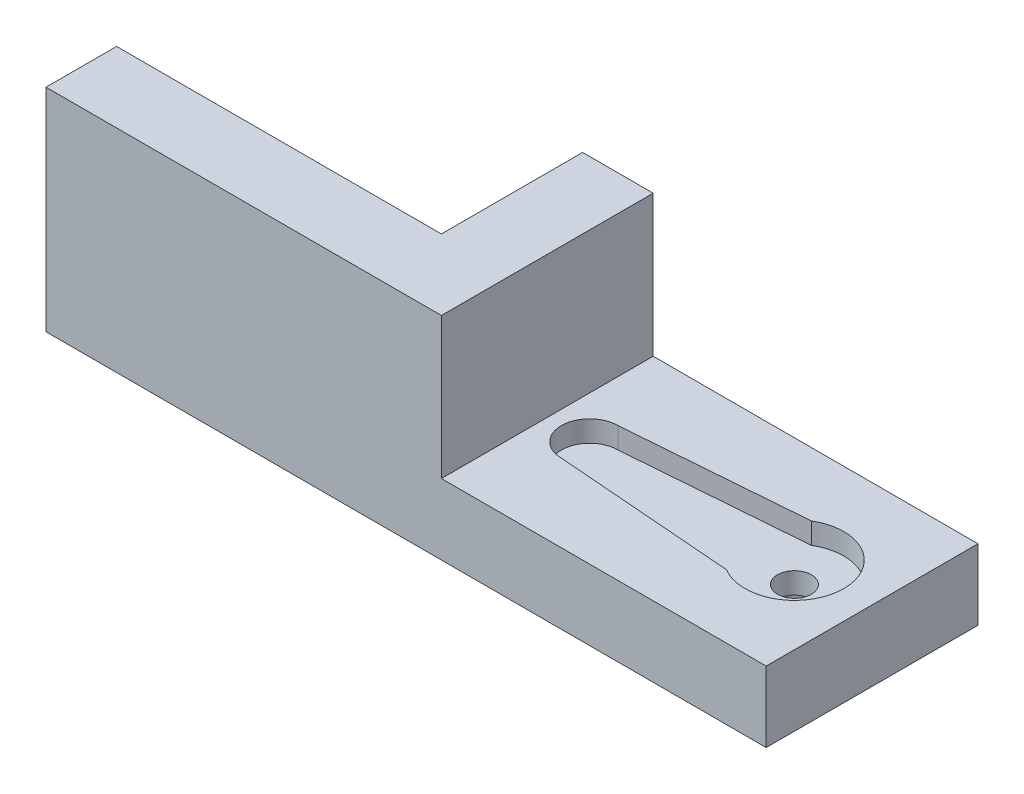
ISO-10303-21;
HEADER;
FILE_DESCRIPTION(('STEP AP214'),'2;1');
FILE_NAME('part.step','',(''),(''),'','','');
FILE_SCHEMA(('AUTOMOTIVE_DESIGN { 1 0 10303 214 1 1 1 1 }'));
ENDSEC;
DATA;
#1=APPLICATION_CONTEXT('core data for automotive mechanical design processes');
#2=APPLICATION_PROTOCOL_DEFINITION('international standard','automotive_design',2000,#1);
#3=PRODUCT_CONTEXT('',#1,'mechanical');
#4=PRODUCT('Part','Part','',(#3));
#5=PRODUCT_RELATED_PRODUCT_CATEGORY('part','',(#4));
#6=PRODUCT_DEFINITION_FORMATION('','',#4);
#7=PRODUCT_DEFINITION_CONTEXT('part definition',#1,'design');
#8=PRODUCT_DEFINITION('design','',#6,#7);
#9=PRODUCT_DEFINITION_SHAPE('','',#8);
#10=(LENGTH_UNIT() NAMED_UNIT(*) SI_UNIT(.MILLI.,.METRE.));
#11=(NAMED_UNIT(*) PLANE_ANGLE_UNIT() SI_UNIT($,.RADIAN.));
#12=(NAMED_UNIT(*) SI_UNIT($,.STERADIAN.) SOLID_ANGLE_UNIT());
#13=UNCERTAINTY_MEASURE_WITH_UNIT(LENGTH_MEASURE(1.E-05),#10,'distance_accuracy_value','');
#14=(GEOMETRIC_REPRESENTATION_CONTEXT(3) GLOBAL_UNCERTAINTY_ASSIGNED_CONTEXT((#13)) GLOBAL_UNIT_ASSIGNED_CONTEXT((#10,
#11,#12)) REPRESENTATION_CONTEXT('',''));
#15=CARTESIAN_POINT('',(0.,0.,0.));
#16=DIRECTION('',(0.,0.,1.));
#17=DIRECTION('',(1.,0.,0.));
#18=AXIS2_PLACEMENT_3D('',#15,#16,#17);
#19=CARTESIAN_POINT('',(-14.,5.,-7.5));
#20=DIRECTION('',(1.,0.,0.));
#21=DIRECTION('',(0.,0.,-1.));
#22=AXIS2_PLACEMENT_3D('',#19,#20,#21);
#23=PLANE('',#22);
#24=DIRECTION('',(0.,-1.,0.));
#25=VECTOR('',#24,1.);
#26=CARTESIAN_POINT('',(-14.,15.,2.5));
#27=LINE('',#26,#25);
#28=CARTESIAN_POINT('',(-14.,15.,2.5));
#29=VERTEX_POINT('',#28);
#30=CARTESIAN_POINT('',(-14.,0.,2.5));
#31=VERTEX_POINT('',#30);
#32=EDGE_CURVE('E221',#29,#31,#27,.T.);
#33=ORIENTED_EDGE('',*,*,#32,.F.);
#34=DIRECTION('',(0.,0.,1.));
#35=VECTOR('',#34,1.);
#36=CARTESIAN_POINT('',(-14.,15.,-7.5));
#37=LINE('',#36,#35);
#38=CARTESIAN_POINT('',(-14.,15.,-7.5));
#39=VERTEX_POINT('',#38);
#40=EDGE_CURVE('E246',#39,#29,#37,.T.);
#41=ORIENTED_EDGE('',*,*,#40,.F.);
#42=DIRECTION('',(0.,-1.,0.));
#43=VECTOR('',#42,1.);
#44=CARTESIAN_POINT('',(-14.,5.,-7.5));
#45=LINE('',#44,#43);
#46=CARTESIAN_POINT('',(-14.,0.,-7.5));
#47=VERTEX_POINT('',#46);
#48=EDGE_CURVE('E41',#39,#47,#45,.T.);
#49=ORIENTED_EDGE('',*,*,#48,.T.);
#50=DIRECTION('',(0.,0.,1.));
#51=VECTOR('',#50,1.);
#52=CARTESIAN_POINT('',(-14.,0.,-7.5));
#53=LINE('',#52,#51);
#54=EDGE_CURVE('E278',#47,#31,#53,.T.);
#55=ORIENTED_EDGE('',*,*,#54,.T.);
#56=EDGE_LOOP('',(#33,#41,#49,#55));
#57=FACE_BOUND('',#56,.T.);
#58=ADVANCED_FACE('F33',(#57),#23,.F.);
#59=CARTESIAN_POINT('',(14.,5.,-7.5));
#60=DIRECTION('',(-1.,0.,0.));
#61=DIRECTION('',(0.,0.,1.));
#62=AXIS2_PLACEMENT_3D('',#59,#60,#61);
#63=PLANE('',#62);
#64=DIRECTION('',(0.,0.,-1.));
#65=VECTOR('',#64,1.);
#66=CARTESIAN_POINT('',(14.,0.,-7.5));
#67=LINE('',#66,#65);
#68=CARTESIAN_POINT('',(14.,0.,7.5));
#69=VERTEX_POINT('',#68);
#70=CARTESIAN_POINT('',(14.,0.,-7.5));
#71=VERTEX_POINT('',#70);
#72=EDGE_CURVE('E264',#69,#71,#67,.T.);
#73=ORIENTED_EDGE('',*,*,#72,.T.);
#74=DIRECTION('',(0.,-1.,0.));
#75=VECTOR('',#74,1.);
#76=CARTESIAN_POINT('',(14.,5.,-7.5));
#77=LINE('',#76,#75);
#78=CARTESIAN_POINT('',(14.,5.,-7.5));
#79=VERTEX_POINT('',#78);
#80=EDGE_CURVE('E11',#79,#71,#77,.T.);
#81=ORIENTED_EDGE('',*,*,#80,.F.);
#82=DIRECTION('',(0.,0.,-1.));
#83=VECTOR('',#82,1.);
#84=CARTESIAN_POINT('',(14.,5.,-7.5));
#85=LINE('',#84,#83);
#86=CARTESIAN_POINT('',(14.,5.,7.5));
#87=VERTEX_POINT('',#86);
#88=EDGE_CURVE('E265',#87,#79,#85,.T.);
#89=ORIENTED_EDGE('',*,*,#88,.F.);
#90=DIRECTION('',(0.,-1.,0.));
#91=VECTOR('',#90,1.);
#92=CARTESIAN_POINT('',(14.,5.,7.5));
#93=LINE('',#92,#91);
#94=EDGE_CURVE('E273',#87,#69,#93,.T.);
#95=ORIENTED_EDGE('',*,*,#94,.T.);
#96=EDGE_LOOP('',(#73,#81,#89,#95));
#97=FACE_BOUND('',#96,.T.);
#98=ADVANCED_FACE('F35',(#97),#63,.F.);
#99=CARTESIAN_POINT('',(-14.,5.,-7.5));
#100=DIRECTION('',(0.,0.,1.));
#101=DIRECTION('',(1.,0.,0.));
#102=AXIS2_PLACEMENT_3D('',#99,#100,#101);
#103=PLANE('',#102);
#104=DIRECTION('',(-1.,0.,0.));
#105=VECTOR('',#104,1.);
#106=CARTESIAN_POINT('',(-14.,0.,-7.5));
#107=LINE('',#106,#105);
#108=EDGE_CURVE('E276',#71,#47,#107,.T.);
#109=ORIENTED_EDGE('',*,*,#108,.T.);
#110=ORIENTED_EDGE('',*,*,#48,.F.);
#111=DIRECTION('',(-1.,0.,0.));
#112=VECTOR('',#111,1.);
#113=CARTESIAN_POINT('',(-14.,15.,-7.5));
#114=LINE('',#113,#112);
#115=CARTESIAN_POINT('',(-9.00000000000001,15.,-7.5));
#116=VERTEX_POINT('',#115);
#117=EDGE_CURVE('E253',#116,#39,#114,.T.);
#118=ORIENTED_EDGE('',*,*,#117,.F.);
#119=DIRECTION('',(0.,-1.,0.));
#120=VECTOR('',#119,1.);
#121=CARTESIAN_POINT('',(-9.00000000000001,15.,-7.5));
#122=LINE('',#121,#120);
#123=CARTESIAN_POINT('',(-9.00000000000001,5.,-7.5));
#124=VERTEX_POINT('',#123);
#125=EDGE_CURVE('E256',#116,#124,#122,.T.);
#126=ORIENTED_EDGE('',*,*,#125,.T.);
#127=DIRECTION('',(-1.,0.,0.));
#128=VECTOR('',#127,1.);
#129=CARTESIAN_POINT('',(-14.,5.,-7.5));
#130=LINE('',#129,#128);
#131=EDGE_CURVE('E268',#79,#124,#130,.T.);
#132=ORIENTED_EDGE('',*,*,#131,.F.);
#133=ORIENTED_EDGE('',*,*,#80,.T.);
#134=EDGE_LOOP('',(#109,#110,#118,#126,#132,#133));
#135=FACE_BOUND('',#134,.T.);
#136=ADVANCED_FACE('F302',(#135),#103,.F.);
#137=CARTESIAN_POINT('',(-14.,5.,7.5));
#138=DIRECTION('',(0.,0.,-1.));
#139=DIRECTION('',(-1.,0.,0.));
#140=AXIS2_PLACEMENT_3D('',#137,#138,#139);
#141=PLANE('',#140);
#142=DIRECTION('',(1.,0.,0.));
#143=VECTOR('',#142,1.);
#144=CARTESIAN_POINT('',(-14.,0.,7.5));
#145=LINE('',#144,#143);
#146=CARTESIAN_POINT('',(-37.,0.,7.5));
#147=VERTEX_POINT('',#146);
#148=EDGE_CURVE('E269',#147,#69,#145,.T.);
#149=ORIENTED_EDGE('',*,*,#148,.T.);
#150=ORIENTED_EDGE('',*,*,#94,.F.);
#151=DIRECTION('',(1.,0.,0.));
#152=VECTOR('',#151,1.);
#153=CARTESIAN_POINT('',(-14.,5.,7.5));
#154=LINE('',#153,#152);
#155=CARTESIAN_POINT('',(-9.00000000000001,5.,7.5));
#156=VERTEX_POINT('',#155);
#157=EDGE_CURVE('E271',#156,#87,#154,.T.);
#158=ORIENTED_EDGE('',*,*,#157,.F.);
#159=DIRECTION('',(0.,-1.,0.));
#160=VECTOR('',#159,1.);
#161=CARTESIAN_POINT('',(-9.,15.,7.5));
#162=LINE('',#161,#160);
#163=CARTESIAN_POINT('',(-9.,15.,7.5));
#164=VERTEX_POINT('',#163);
#165=EDGE_CURVE('E261',#164,#156,#162,.T.);
#166=ORIENTED_EDGE('',*,*,#165,.F.);
#167=DIRECTION('',(1.,0.,0.));
#168=VECTOR('',#167,1.);
#169=CARTESIAN_POINT('',(-14.,15.,7.5));
#170=LINE('',#169,#168);
#171=CARTESIAN_POINT('',(-37.,15.,7.5));
#172=VERTEX_POINT('',#171);
#173=EDGE_CURVE('E249',#172,#164,#170,.T.);
#174=ORIENTED_EDGE('',*,*,#173,.F.);
#175=DIRECTION('',(0.,1.,0.));
#176=VECTOR('',#175,1.);
#177=CARTESIAN_POINT('',(-37.,15.,7.5));
#178=LINE('',#177,#176);
#179=EDGE_CURVE('E227',#147,#172,#178,.T.);
#180=ORIENTED_EDGE('',*,*,#179,.F.);
#181=EDGE_LOOP('',(#149,#150,#158,#166,#174,#180));
#182=FACE_BOUND('',#181,.T.);
#183=ADVANCED_FACE('F311',(#182),#141,.F.);
#184=CARTESIAN_POINT('',(0.,5.,0.));
#185=DIRECTION('',(0.,1.,0.));
#186=DIRECTION('',(0.,0.,1.));
#187=AXIS2_PLACEMENT_3D('',#184,#185,#186);
#188=PLANE('',#187);
#189=CARTESIAN_POINT('',(8.5,5.,0.));
#190=DIRECTION('',(0.,1.,0.));
#191=DIRECTION('',(0.,0.,1.));
#192=AXIS2_PLACEMENT_3D('',#189,#190,#191);
#193=CIRCLE('',#192,3.5);
#194=CARTESIAN_POINT('',(6.697224362268,5.,3.));
#195=VERTEX_POINT('',#194);
#196=CARTESIAN_POINT('',(6.697224362268,5.,-3.));
#197=VERTEX_POINT('',#196);
#198=EDGE_CURVE('E56',#195,#197,#193,.T.);
#199=ORIENTED_EDGE('',*,*,#198,.F.);
#200=DIRECTION('',(0.99691299181043,0.,0.0785142455836985));
#201=VECTOR('',#200,1.);
#202=CARTESIAN_POINT('',(-6.,5.,2.));
#203=LINE('',#202,#201);
#204=CARTESIAN_POINT('',(-6.,5.,2.));
#205=VERTEX_POINT('',#204);
#206=EDGE_CURVE('E200',#205,#195,#203,.T.);
#207=ORIENTED_EDGE('',*,*,#206,.F.);
#208=CARTESIAN_POINT('',(-6.,5.,0.));
#209=DIRECTION('',(0.,1.,0.));
#210=DIRECTION('',(0.,0.,1.));
#211=AXIS2_PLACEMENT_3D('',#208,#209,#210);
#212=CIRCLE('',#211,2.);
#213=CARTESIAN_POINT('',(-6.,5.,-2.));
#214=VERTEX_POINT('',#213);
#215=EDGE_CURVE('E214',#214,#205,#212,.T.);
#216=ORIENTED_EDGE('',*,*,#215,.F.);
#217=DIRECTION('',(-0.99691299181043,0.,0.0785142455836984));
#218=VECTOR('',#217,1.);
#219=CARTESIAN_POINT('',(-6.,5.,-2.));
#220=LINE('',#219,#218);
#221=EDGE_CURVE('E211',#197,#214,#220,.T.);
#222=ORIENTED_EDGE('',*,*,#221,.F.);
#223=EDGE_LOOP('',(#199,#207,#216,#222));
#224=FACE_BOUND('',#223,.T.);
#225=DIRECTION('',(0.,0.,-1.));
#226=VECTOR('',#225,1.);
#227=CARTESIAN_POINT('',(-9.00000000000001,5.,-7.5));
#228=LINE('',#227,#226);
#229=EDGE_CURVE('E245',#156,#124,#228,.T.);
#230=ORIENTED_EDGE('',*,*,#229,.F.);
#231=ORIENTED_EDGE('',*,*,#157,.T.);
#232=ORIENTED_EDGE('',*,*,#88,.T.);
#233=ORIENTED_EDGE('',*,*,#131,.T.);
#234=EDGE_LOOP('',(#230,#231,#232,#233));
#235=FACE_BOUND('',#234,.T.);
#236=ADVANCED_FACE('F308',(#224,#235),#188,.T.);
#237=CARTESIAN_POINT('',(0.,0.,0.));
#238=DIRECTION('',(0.,1.,0.));
#239=DIRECTION('',(0.,0.,1.));
#240=AXIS2_PLACEMENT_3D('',#237,#238,#239);
#241=PLANE('',#240);
#242=CARTESIAN_POINT('',(8.5,0.,0.));
#243=DIRECTION('',(0.,-1.,0.));
#244=DIRECTION('',(0.,0.,-1.));
#245=AXIS2_PLACEMENT_3D('',#242,#243,#244);
#246=CIRCLE('',#245,2.19999999999999);
#247=CARTESIAN_POINT('',(8.5,0.,-2.19999999999999));
#248=VERTEX_POINT('',#247);
#249=EDGE_CURVE('E181',#248,#248,#246,.T.);
#250=ORIENTED_EDGE('',*,*,#249,.F.);
#251=EDGE_LOOP('',(#250));
#252=FACE_BOUND('',#251,.T.);
#253=ORIENTED_EDGE('',*,*,#72,.F.);
#254=ORIENTED_EDGE('',*,*,#148,.F.);
#255=DIRECTION('',(0.,0.,1.));
#256=VECTOR('',#255,1.);
#257=CARTESIAN_POINT('',(-37.,0.,7.5));
#258=LINE('',#257,#256);
#259=CARTESIAN_POINT('',(-37.,0.,2.5));
#260=VERTEX_POINT('',#259);
#261=EDGE_CURVE('E234',#260,#147,#258,.T.);
#262=ORIENTED_EDGE('',*,*,#261,.F.);
#263=DIRECTION('',(1.,0.,0.));
#264=VECTOR('',#263,1.);
#265=CARTESIAN_POINT('',(-37.,0.,2.5));
#266=LINE('',#265,#264);
#267=EDGE_CURVE('E237',#260,#31,#266,.T.);
#268=ORIENTED_EDGE('',*,*,#267,.T.);
#269=ORIENTED_EDGE('',*,*,#54,.F.);
#270=ORIENTED_EDGE('',*,*,#108,.F.);
#271=EDGE_LOOP('',(#253,#254,#262,#268,#269,#270));
#272=FACE_BOUND('',#271,.T.);
#273=ADVANCED_FACE('F290',(#252,#272),#241,.F.);
#274=CARTESIAN_POINT('',(-9.00000000000001,15.,-7.5));
#275=DIRECTION('',(-1.,0.,0.));
#276=DIRECTION('',(0.,0.,1.));
#277=AXIS2_PLACEMENT_3D('',#274,#275,#276);
#278=PLANE('',#277);
#279=ORIENTED_EDGE('',*,*,#229,.T.);
#280=ORIENTED_EDGE('',*,*,#125,.F.);
#281=DIRECTION('',(0.,0.,-1.));
#282=VECTOR('',#281,1.);
#283=CARTESIAN_POINT('',(-9.00000000000001,15.,-7.5));
#284=LINE('',#283,#282);
#285=EDGE_CURVE('E251',#164,#116,#284,.T.);
#286=ORIENTED_EDGE('',*,*,#285,.F.);
#287=ORIENTED_EDGE('',*,*,#165,.T.);
#288=EDGE_LOOP('',(#279,#280,#286,#287));
#289=FACE_BOUND('',#288,.T.);
#290=ADVANCED_FACE('F304',(#289),#278,.F.);
#291=CARTESIAN_POINT('',(0.,15.,0.));
#292=DIRECTION('',(0.,1.,0.));
#293=DIRECTION('',(0.,0.,1.));
#294=AXIS2_PLACEMENT_3D('',#291,#292,#293);
#295=PLANE('',#294);
#296=ORIENTED_EDGE('',*,*,#40,.T.);
#297=DIRECTION('',(1.,0.,0.));
#298=VECTOR('',#297,1.);
#299=CARTESIAN_POINT('',(-37.,15.,2.5));
#300=LINE('',#299,#298);
#301=CARTESIAN_POINT('',(-37.,15.,2.5));
#302=VERTEX_POINT('',#301);
#303=EDGE_CURVE('E242',#302,#29,#300,.T.);
#304=ORIENTED_EDGE('',*,*,#303,.F.);
#305=DIRECTION('',(0.,0.,-1.));
#306=VECTOR('',#305,1.);
#307=CARTESIAN_POINT('',(-37.,15.,7.5));
#308=LINE('',#307,#306);
#309=EDGE_CURVE('E230',#172,#302,#308,.T.);
#310=ORIENTED_EDGE('',*,*,#309,.F.);
#311=ORIENTED_EDGE('',*,*,#173,.T.);
#312=ORIENTED_EDGE('',*,*,#285,.T.);
#313=ORIENTED_EDGE('',*,*,#117,.T.);
#314=EDGE_LOOP('',(#296,#304,#310,#311,#312,#313));
#315=FACE_BOUND('',#314,.T.);
#316=ADVANCED_FACE('F298',(#315),#295,.T.);
#317=CARTESIAN_POINT('',(-37.,15.,2.5));
#318=DIRECTION('',(0.,0.,1.));
#319=DIRECTION('',(0.,-1.,0.));
#320=AXIS2_PLACEMENT_3D('',#317,#318,#319);
#321=PLANE('',#320);
#322=DIRECTION('',(0.99691299181043,-0.0785142455836983,0.));
#323=VECTOR('',#322,1.);
#324=CARTESIAN_POINT('',(-17.,9.5,2.5));
#325=LINE('',#324,#323);
#326=CARTESIAN_POINT('',(-29.697224362268,10.5,2.5));
#327=VERTEX_POINT('',#326);
#328=CARTESIAN_POINT('',(-17.,9.5,2.5));
#329=VERTEX_POINT('',#328);
#330=EDGE_CURVE('E175',#327,#329,#325,.T.);
#331=ORIENTED_EDGE('',*,*,#330,.F.);
#332=CARTESIAN_POINT('',(-31.5,7.5,2.5));
#333=DIRECTION('',(0.,0.,-1.));
#334=DIRECTION('',(0.,1.,0.));
#335=AXIS2_PLACEMENT_3D('',#332,#333,#334);
#336=CIRCLE('',#335,3.5);
#337=CARTESIAN_POINT('',(-29.697224362268,4.5,2.5));
#338=VERTEX_POINT('',#337);
#339=EDGE_CURVE('E48',#338,#327,#336,.T.);
#340=ORIENTED_EDGE('',*,*,#339,.F.);
#341=DIRECTION('',(-0.99691299181043,-0.0785142455836983,0.));
#342=VECTOR('',#341,1.);
#343=CARTESIAN_POINT('',(-17.,5.5,2.5));
#344=LINE('',#343,#342);
#345=CARTESIAN_POINT('',(-17.,5.5,2.5));
#346=VERTEX_POINT('',#345);
#347=EDGE_CURVE('E166',#346,#338,#344,.T.);
#348=ORIENTED_EDGE('',*,*,#347,.F.);
#349=CARTESIAN_POINT('',(-17.,7.5,2.5));
#350=DIRECTION('',(0.,0.,-1.));
#351=DIRECTION('',(0.,1.,0.));
#352=AXIS2_PLACEMENT_3D('',#349,#350,#351);
#353=CIRCLE('',#352,2.);
#354=EDGE_CURVE('E169',#329,#346,#353,.T.);
#355=ORIENTED_EDGE('',*,*,#354,.F.);
#356=EDGE_LOOP('',(#331,#340,#348,#355));
#357=FACE_BOUND('',#356,.T.);
#358=ORIENTED_EDGE('',*,*,#32,.T.);
#359=ORIENTED_EDGE('',*,*,#267,.F.);
#360=DIRECTION('',(0.,-1.,0.));
#361=VECTOR('',#360,1.);
#362=CARTESIAN_POINT('',(-37.,15.,2.5));
#363=LINE('',#362,#361);
#364=EDGE_CURVE('E232',#302,#260,#363,.T.);
#365=ORIENTED_EDGE('',*,*,#364,.F.);
#366=ORIENTED_EDGE('',*,*,#303,.T.);
#367=EDGE_LOOP('',(#358,#359,#365,#366));
#368=FACE_BOUND('',#367,.T.);
#369=ADVANCED_FACE('F295',(#357,#368),#321,.F.);
#370=CARTESIAN_POINT('',(-37.,0.,0.));
#371=DIRECTION('',(1.,0.,0.));
#372=DIRECTION('',(0.,0.,-1.));
#373=AXIS2_PLACEMENT_3D('',#370,#371,#372);
#374=PLANE('',#373);
#375=ORIENTED_EDGE('',*,*,#179,.T.);
#376=ORIENTED_EDGE('',*,*,#309,.T.);
#377=ORIENTED_EDGE('',*,*,#364,.T.);
#378=ORIENTED_EDGE('',*,*,#261,.T.);
#379=EDGE_LOOP('',(#375,#376,#377,#378));
#380=FACE_BOUND('',#379,.T.);
#381=ADVANCED_FACE('F317',(#380),#374,.F.);
#382=CARTESIAN_POINT('',(8.5,3.5,0.));
#383=DIRECTION('',(0.,1.,0.));
#384=DIRECTION('',(0.,0.,1.));
#385=AXIS2_PLACEMENT_3D('',#382,#383,#384);
#386=CYLINDRICAL_SURFACE('',#385,3.5);
#387=ORIENTED_EDGE('',*,*,#198,.T.);
#388=DIRECTION('',(0.,1.,0.));
#389=VECTOR('',#388,1.);
#390=CARTESIAN_POINT('',(6.697224362268,3.5,-3.));
#391=LINE('',#390,#389);
#392=CARTESIAN_POINT('',(6.697224362268,3.5,-3.));
#393=VERTEX_POINT('',#392);
#394=EDGE_CURVE('E209',#393,#197,#391,.T.);
#395=ORIENTED_EDGE('',*,*,#394,.F.);
#396=CARTESIAN_POINT('',(8.5,3.5,0.));
#397=DIRECTION('',(0.,1.,0.));
#398=DIRECTION('',(0.,0.,1.));
#399=AXIS2_PLACEMENT_3D('',#396,#397,#398);
#400=CIRCLE('',#399,3.5);
#401=CARTESIAN_POINT('',(6.697224362268,3.5,3.));
#402=VERTEX_POINT('',#401);
#403=EDGE_CURVE('E196',#402,#393,#400,.T.);
#404=ORIENTED_EDGE('',*,*,#403,.F.);
#405=DIRECTION('',(0.,1.,0.));
#406=VECTOR('',#405,1.);
#407=CARTESIAN_POINT('',(6.697224362268,3.5,3.));
#408=LINE('',#407,#406);
#409=EDGE_CURVE('E219',#402,#195,#408,.T.);
#410=ORIENTED_EDGE('',*,*,#409,.T.);
#411=EDGE_LOOP('',(#387,#395,#404,#410));
#412=FACE_BOUND('',#411,.T.);
#413=ADVANCED_FACE('F319',(#412),#386,.F.);
#414=CARTESIAN_POINT('',(-6.,3.5,2.));
#415=DIRECTION('',(-0.0785142455836985,0.,0.99691299181043));
#416=DIRECTION('',(0.99691299181043,0.,0.0785142455836985));
#417=AXIS2_PLACEMENT_3D('',#414,#415,#416);
#418=PLANE('',#417);
#419=ORIENTED_EDGE('',*,*,#206,.T.);
#420=ORIENTED_EDGE('',*,*,#409,.F.);
#421=DIRECTION('',(0.99691299181043,0.,0.0785142455836985));
#422=VECTOR('',#421,1.);
#423=CARTESIAN_POINT('',(-6.,3.5,2.));
#424=LINE('',#423,#422);
#425=CARTESIAN_POINT('',(-6.,3.5,2.));
#426=VERTEX_POINT('',#425);
#427=EDGE_CURVE('E206',#426,#402,#424,.T.);
#428=ORIENTED_EDGE('',*,*,#427,.F.);
#429=DIRECTION('',(0.,1.,0.));
#430=VECTOR('',#429,1.);
#431=CARTESIAN_POINT('',(-6.,3.5,2.));
#432=LINE('',#431,#430);
#433=EDGE_CURVE('E222',#426,#205,#432,.T.);
#434=ORIENTED_EDGE('',*,*,#433,.T.);
#435=EDGE_LOOP('',(#419,#420,#428,#434));
#436=FACE_BOUND('',#435,.T.);
#437=ADVANCED_FACE('F325',(#436),#418,.F.);
#438=CARTESIAN_POINT('',(-6.,3.5,0.));
#439=DIRECTION('',(0.,1.,0.));
#440=DIRECTION('',(0.,0.,1.));
#441=AXIS2_PLACEMENT_3D('',#438,#439,#440);
#442=CYLINDRICAL_SURFACE('',#441,2.);
#443=ORIENTED_EDGE('',*,*,#215,.T.);
#444=ORIENTED_EDGE('',*,*,#433,.F.);
#445=CARTESIAN_POINT('',(-6.,3.5,0.));
#446=DIRECTION('',(0.,1.,0.));
#447=DIRECTION('',(0.,0.,1.));
#448=AXIS2_PLACEMENT_3D('',#445,#446,#447);
#449=CIRCLE('',#448,2.);
#450=CARTESIAN_POINT('',(-6.,3.5,-2.));
#451=VERTEX_POINT('',#450);
#452=EDGE_CURVE('E203',#451,#426,#449,.T.);
#453=ORIENTED_EDGE('',*,*,#452,.F.);
#454=DIRECTION('',(0.,1.,0.));
#455=VECTOR('',#454,1.);
#456=CARTESIAN_POINT('',(-6.,3.5,-2.));
#457=LINE('',#456,#455);
#458=EDGE_CURVE('E224',#451,#214,#457,.T.);
#459=ORIENTED_EDGE('',*,*,#458,.T.);
#460=EDGE_LOOP('',(#443,#444,#453,#459));
#461=FACE_BOUND('',#460,.T.);
#462=ADVANCED_FACE('F434',(#461),#442,.F.);
#463=CARTESIAN_POINT('',(-6.,3.5,-2.));
#464=DIRECTION('',(-0.0785142455836984,0.,-0.99691299181043));
#465=DIRECTION('',(-0.99691299181043,0.,0.0785142455836984));
#466=AXIS2_PLACEMENT_3D('',#463,#464,#465);
#467=PLANE('',#466);
#468=ORIENTED_EDGE('',*,*,#221,.T.);
#469=ORIENTED_EDGE('',*,*,#458,.F.);
#470=DIRECTION('',(-0.99691299181043,0.,0.0785142455836984));
#471=VECTOR('',#470,1.);
#472=CARTESIAN_POINT('',(-6.,3.5,-2.));
#473=LINE('',#472,#471);
#474=EDGE_CURVE('E199',#393,#451,#473,.T.);
#475=ORIENTED_EDGE('',*,*,#474,.F.);
#476=ORIENTED_EDGE('',*,*,#394,.T.);
#477=EDGE_LOOP('',(#468,#469,#475,#476));
#478=FACE_BOUND('',#477,.T.);
#479=ADVANCED_FACE('F430',(#478),#467,.F.);
#480=CARTESIAN_POINT('',(8.5,3.5,0.));
#481=DIRECTION('',(0.,1.,0.));
#482=DIRECTION('',(0.,0.,1.));
#483=AXIS2_PLACEMENT_3D('',#480,#481,#482);
#484=PLANE('',#483);
#485=CARTESIAN_POINT('',(8.5,3.5,0.));
#486=DIRECTION('',(0.,1.,0.));
#487=DIRECTION('',(0.,0.,1.));
#488=AXIS2_PLACEMENT_3D('',#485,#486,#487);
#489=CIRCLE('',#488,1.20000000000001);
#490=CARTESIAN_POINT('',(8.5,3.5,1.20000000000001));
#491=VERTEX_POINT('',#490);
#492=EDGE_CURVE('E193',#491,#491,#489,.T.);
#493=ORIENTED_EDGE('',*,*,#492,.F.);
#494=EDGE_LOOP('',(#493));
#495=FACE_BOUND('',#494,.T.);
#496=ORIENTED_EDGE('',*,*,#403,.T.);
#497=ORIENTED_EDGE('',*,*,#474,.T.);
#498=ORIENTED_EDGE('',*,*,#452,.T.);
#499=ORIENTED_EDGE('',*,*,#427,.T.);
#500=EDGE_LOOP('',(#496,#497,#498,#499));
#501=FACE_BOUND('',#500,.T.);
#502=ADVANCED_FACE('F426',(#495,#501),#484,.T.);
#503=CARTESIAN_POINT('',(8.5,0.,0.));
#504=DIRECTION('',(0.,-1.,0.));
#505=DIRECTION('',(0.,0.,-1.));
#506=AXIS2_PLACEMENT_3D('',#503,#504,#505);
#507=CYLINDRICAL_SURFACE('',#506,1.20000000000001);
#508=CARTESIAN_POINT('',(8.5,2.,0.));
#509=DIRECTION('',(0.,-1.,0.));
#510=DIRECTION('',(0.,0.,-1.));
#511=AXIS2_PLACEMENT_3D('',#508,#509,#510);
#512=CIRCLE('',#511,1.20000000000001);
#513=CARTESIAN_POINT('',(8.5,2.,-1.20000000000001));
#514=VERTEX_POINT('',#513);
#515=EDGE_CURVE('E190',#514,#514,#512,.T.);
#516=ORIENTED_EDGE('',*,*,#515,.T.);
#517=EDGE_LOOP('',(#516));
#518=FACE_BOUND('',#517,.T.);
#519=ORIENTED_EDGE('',*,*,#492,.T.);
#520=EDGE_LOOP('',(#519));
#521=FACE_BOUND('',#520,.T.);
#522=ADVANCED_FACE('F422',(#518,#521),#507,.F.);
#523=CARTESIAN_POINT('',(9.70000000000001,2.,0.));
#524=DIRECTION('',(0.,1.,0.));
#525=DIRECTION('',(0.,0.,1.));
#526=AXIS2_PLACEMENT_3D('',#523,#524,#525);
#527=PLANE('',#526);
#528=ORIENTED_EDGE('',*,*,#515,.F.);
#529=EDGE_LOOP('',(#528));
#530=FACE_BOUND('',#529,.T.);
#531=CARTESIAN_POINT('',(8.5,2.,0.));
#532=DIRECTION('',(0.,-1.,0.));
#533=DIRECTION('',(0.,0.,-1.));
#534=AXIS2_PLACEMENT_3D('',#531,#532,#533);
#535=CIRCLE('',#534,2.19999999999999);
#536=CARTESIAN_POINT('',(8.5,2.,-2.19999999999999));
#537=VERTEX_POINT('',#536);
#538=EDGE_CURVE('E187',#537,#537,#535,.T.);
#539=ORIENTED_EDGE('',*,*,#538,.T.);
#540=EDGE_LOOP('',(#539));
#541=FACE_BOUND('',#540,.T.);
#542=ADVANCED_FACE('F418',(#530,#541),#527,.F.);
#543=CARTESIAN_POINT('',(8.5,0.,0.));
#544=DIRECTION('',(0.,-1.,0.));
#545=DIRECTION('',(0.,0.,-1.));
#546=AXIS2_PLACEMENT_3D('',#543,#544,#545);
#547=CYLINDRICAL_SURFACE('',#546,2.19999999999999);
#548=ORIENTED_EDGE('',*,*,#538,.F.);
#549=EDGE_LOOP('',(#548));
#550=FACE_BOUND('',#549,.T.);
#551=ORIENTED_EDGE('',*,*,#249,.T.);
#552=EDGE_LOOP('',(#551));
#553=FACE_BOUND('',#552,.T.);
#554=ADVANCED_FACE('F368',(#550,#553),#547,.F.);
#555=CARTESIAN_POINT('',(-31.5,7.5,4.));
#556=DIRECTION('',(0.,0.,-1.));
#557=DIRECTION('',(0.,1.,0.));
#558=AXIS2_PLACEMENT_3D('',#555,#556,#557);
#559=CYLINDRICAL_SURFACE('',#558,3.5);
#560=ORIENTED_EDGE('',*,*,#339,.T.);
#561=DIRECTION('',(0.,0.,-1.));
#562=VECTOR('',#561,1.);
#563=CARTESIAN_POINT('',(-29.697224362268,10.5,4.));
#564=LINE('',#563,#562);
#565=CARTESIAN_POINT('',(-29.697224362268,10.5,4.));
#566=VERTEX_POINT('',#565);
#567=EDGE_CURVE('E144',#566,#327,#564,.T.);
#568=ORIENTED_EDGE('',*,*,#567,.F.);
#569=CARTESIAN_POINT('',(-31.5,7.5,4.));
#570=DIRECTION('',(0.,0.,-1.));
#571=DIRECTION('',(0.,1.,0.));
#572=AXIS2_PLACEMENT_3D('',#569,#570,#571);
#573=CIRCLE('',#572,3.5);
#574=CARTESIAN_POINT('',(-29.697224362268,4.5,4.));
#575=VERTEX_POINT('',#574);
#576=EDGE_CURVE('E148',#575,#566,#573,.T.);
#577=ORIENTED_EDGE('',*,*,#576,.F.);
#578=DIRECTION('',(0.,0.,-1.));
#579=VECTOR('',#578,1.);
#580=CARTESIAN_POINT('',(-29.697224362268,4.5,4.));
#581=LINE('',#580,#579);
#582=EDGE_CURVE('E179',#575,#338,#581,.T.);
#583=ORIENTED_EDGE('',*,*,#582,.T.);
#584=EDGE_LOOP('',(#560,#568,#577,#583));
#585=FACE_BOUND('',#584,.T.);
#586=ADVANCED_FACE('F146',(#585),#559,.F.);
#587=CARTESIAN_POINT('',(-17.,5.5,4.));
#588=DIRECTION('',(0.0785142455836983,-0.99691299181043,0.));
#589=DIRECTION('',(0.99691299181043,0.0785142455836983,0.));
#590=AXIS2_PLACEMENT_3D('',#587,#588,#589);
#591=PLANE('',#590);
#592=ORIENTED_EDGE('',*,*,#347,.T.);
#593=ORIENTED_EDGE('',*,*,#582,.F.);
#594=DIRECTION('',(-0.99691299181043,-0.0785142455836983,0.));
#595=VECTOR('',#594,1.);
#596=CARTESIAN_POINT('',(-17.,5.5,4.));
#597=LINE('',#596,#595);
#598=CARTESIAN_POINT('',(-17.,5.5,4.));
#599=VERTEX_POINT('',#598);
#600=EDGE_CURVE('E154',#599,#575,#597,.T.);
#601=ORIENTED_EDGE('',*,*,#600,.F.);
#602=DIRECTION('',(0.,0.,-1.));
#603=VECTOR('',#602,1.);
#604=CARTESIAN_POINT('',(-17.,5.5,4.));
#605=LINE('',#604,#603);
#606=EDGE_CURVE('E182',#599,#346,#605,.T.);
#607=ORIENTED_EDGE('',*,*,#606,.T.);
#608=EDGE_LOOP('',(#592,#593,#601,#607));
#609=FACE_BOUND('',#608,.T.);
#610=ADVANCED_FACE('F377',(#609),#591,.F.);
#611=CARTESIAN_POINT('',(-17.,7.5,4.));
#612=DIRECTION('',(0.,0.,-1.));
#613=DIRECTION('',(0.,1.,0.));
#614=AXIS2_PLACEMENT_3D('',#611,#612,#613);
#615=CYLINDRICAL_SURFACE('',#614,2.);
#616=ORIENTED_EDGE('',*,*,#354,.T.);
#617=ORIENTED_EDGE('',*,*,#606,.F.);
#618=CARTESIAN_POINT('',(-17.,7.5,4.));
#619=DIRECTION('',(0.,0.,-1.));
#620=DIRECTION('',(0.,1.,0.));
#621=AXIS2_PLACEMENT_3D('',#618,#619,#620);
#622=CIRCLE('',#621,2.);
#623=CARTESIAN_POINT('',(-17.,9.5,4.));
#624=VERTEX_POINT('',#623);
#625=EDGE_CURVE('E162',#624,#599,#622,.T.);
#626=ORIENTED_EDGE('',*,*,#625,.F.);
#627=DIRECTION('',(0.,0.,-1.));
#628=VECTOR('',#627,1.);
#629=CARTESIAN_POINT('',(-17.,9.5,4.));
#630=LINE('',#629,#628);
#631=EDGE_CURVE('E153',#624,#329,#630,.T.);
#632=ORIENTED_EDGE('',*,*,#631,.T.);
#633=EDGE_LOOP('',(#616,#617,#626,#632));
#634=FACE_BOUND('',#633,.T.);
#635=ADVANCED_FACE('F386',(#634),#615,.F.);
#636=CARTESIAN_POINT('',(-17.,9.5,4.));
#637=DIRECTION('',(0.0785142455836983,0.99691299181043,0.));
#638=DIRECTION('',(-0.99691299181043,0.0785142455836983,0.));
#639=AXIS2_PLACEMENT_3D('',#636,#637,#638);
#640=PLANE('',#639);
#641=ORIENTED_EDGE('',*,*,#330,.T.);
#642=ORIENTED_EDGE('',*,*,#631,.F.);
#643=DIRECTION('',(0.99691299181043,-0.0785142455836983,0.));
#644=VECTOR('',#643,1.);
#645=CARTESIAN_POINT('',(-17.,9.5,4.));
#646=LINE('',#645,#644);
#647=EDGE_CURVE('E157',#566,#624,#646,.T.);
#648=ORIENTED_EDGE('',*,*,#647,.F.);
#649=ORIENTED_EDGE('',*,*,#567,.T.);
#650=EDGE_LOOP('',(#641,#642,#648,#649));
#651=FACE_BOUND('',#650,.T.);
#652=ADVANCED_FACE('F158',(#651),#640,.F.);
#653=CARTESIAN_POINT('',(-31.5,7.5,4.));
#654=DIRECTION('',(0.,0.,-1.));
#655=DIRECTION('',(0.,1.,0.));
#656=AXIS2_PLACEMENT_3D('',#653,#654,#655);
#657=PLANE('',#656);
#658=ORIENTED_EDGE('',*,*,#576,.T.);
#659=ORIENTED_EDGE('',*,*,#647,.T.);
#660=ORIENTED_EDGE('',*,*,#625,.T.);
#661=ORIENTED_EDGE('',*,*,#600,.T.);
#662=EDGE_LOOP('',(#658,#659,#660,#661));
#663=FACE_BOUND('',#662,.T.);
#664=ADVANCED_FACE('F164',(#663),#657,.T.);
#665=CLOSED_SHELL('',(#58,#98,#136,#183,#236,#273,#290,#316,#369,#381,#413,#437,#462,#479,#502,
#522,#542,#554,#586,#610,#635,#652,#664));
#666=MANIFOLD_SOLID_BREP('B2',#665);
#667=ADVANCED_BREP_SHAPE_REPRESENTATION('',(#18,#666),#14);
#668=SHAPE_DEFINITION_REPRESENTATION(#9,#667);
ENDSEC;
END-ISO-10303-21;
